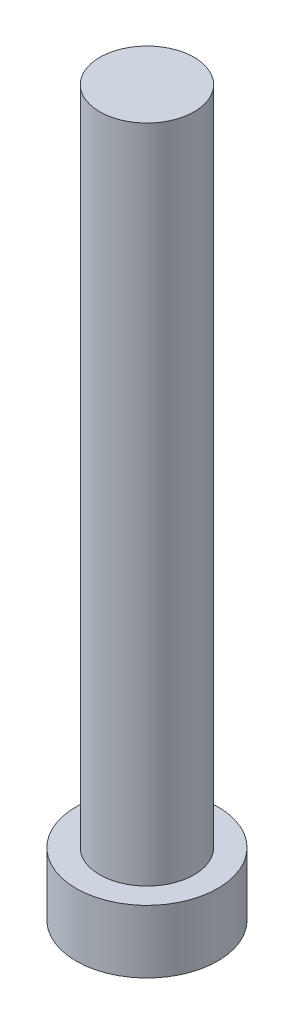
ISO-10303-21;
HEADER;
FILE_DESCRIPTION(('STEP AP214'),'2;1');
FILE_NAME('part.step','',(''),(''),'','','');
FILE_SCHEMA(('AUTOMOTIVE_DESIGN { 1 0 10303 214 1 1 1 1 }'));
ENDSEC;
DATA;
#1=APPLICATION_CONTEXT('core data for automotive mechanical design processes');
#2=APPLICATION_PROTOCOL_DEFINITION('international standard','automotive_design',2000,#1);
#3=PRODUCT_CONTEXT('',#1,'mechanical');
#4=PRODUCT('Part','Part','',(#3));
#5=PRODUCT_RELATED_PRODUCT_CATEGORY('part','',(#4));
#6=PRODUCT_DEFINITION_FORMATION('','',#4);
#7=PRODUCT_DEFINITION_CONTEXT('part definition',#1,'design');
#8=PRODUCT_DEFINITION('design','',#6,#7);
#9=PRODUCT_DEFINITION_SHAPE('','',#8);
#10=(LENGTH_UNIT() NAMED_UNIT(*) SI_UNIT(.MILLI.,.METRE.));
#11=(NAMED_UNIT(*) PLANE_ANGLE_UNIT() SI_UNIT($,.RADIAN.));
#12=(NAMED_UNIT(*) SI_UNIT($,.STERADIAN.) SOLID_ANGLE_UNIT());
#13=UNCERTAINTY_MEASURE_WITH_UNIT(LENGTH_MEASURE(1.E-05),#10,'distance_accuracy_value','');
#14=(GEOMETRIC_REPRESENTATION_CONTEXT(3) GLOBAL_UNCERTAINTY_ASSIGNED_CONTEXT((#13)) GLOBAL_UNIT_ASSIGNED_CONTEXT((#10,
#11,#12)) REPRESENTATION_CONTEXT('',''));
#15=CARTESIAN_POINT('',(0.,0.,0.));
#16=DIRECTION('',(0.,0.,1.));
#17=DIRECTION('',(1.,0.,0.));
#18=AXIS2_PLACEMENT_3D('',#15,#16,#17);
#19=CARTESIAN_POINT('',(0.,20.,0.));
#20=DIRECTION('',(0.,-1.,0.));
#21=DIRECTION('',(0.,0.,-1.));
#22=AXIS2_PLACEMENT_3D('',#19,#20,#21);
#23=CYLINDRICAL_SURFACE('',#22,22.5);
#24=CARTESIAN_POINT('',(0.,20.,0.));
#25=DIRECTION('',(0.,1.,0.));
#26=DIRECTION('',(0.,0.,1.));
#27=AXIS2_PLACEMENT_3D('',#24,#25,#26);
#28=CIRCLE('',#27,22.5);
#29=CARTESIAN_POINT('',(0.,20.,22.5));
#30=VERTEX_POINT('',#29);
#31=EDGE_CURVE('E42',#30,#30,#28,.T.);
#32=ORIENTED_EDGE('',*,*,#31,.F.);
#33=EDGE_LOOP('',(#32));
#34=FACE_BOUND('',#33,.T.);
#35=CARTESIAN_POINT('',(0.,0.,0.));
#36=DIRECTION('',(0.,1.,0.));
#37=DIRECTION('',(0.,0.,1.));
#38=AXIS2_PLACEMENT_3D('',#35,#36,#37);
#39=CIRCLE('',#38,22.5);
#40=CARTESIAN_POINT('',(0.,0.,22.5));
#41=VERTEX_POINT('',#40);
#42=EDGE_CURVE('E38',#41,#41,#39,.T.);
#43=ORIENTED_EDGE('',*,*,#42,.T.);
#44=EDGE_LOOP('',(#43));
#45=FACE_BOUND('',#44,.T.);
#46=ADVANCED_FACE('F35',(#34,#45),#23,.T.);
#47=CARTESIAN_POINT('',(0.,20.,0.));
#48=DIRECTION('',(0.,1.,0.));
#49=DIRECTION('',(0.,0.,1.));
#50=AXIS2_PLACEMENT_3D('',#47,#48,#49);
#51=PLANE('',#50);
#52=CARTESIAN_POINT('',(0.,20.,0.));
#53=DIRECTION('',(0.,1.,0.));
#54=DIRECTION('',(0.,0.,1.));
#55=AXIS2_PLACEMENT_3D('',#52,#53,#54);
#56=CIRCLE('',#55,15.);
#57=CARTESIAN_POINT('',(0.,20.,15.));
#58=VERTEX_POINT('',#57);
#59=EDGE_CURVE('E10',#58,#58,#56,.T.);
#60=ORIENTED_EDGE('',*,*,#59,.F.);
#61=EDGE_LOOP('',(#60));
#62=FACE_BOUND('',#61,.T.);
#63=ORIENTED_EDGE('',*,*,#31,.T.);
#64=EDGE_LOOP('',(#63));
#65=FACE_BOUND('',#64,.T.);
#66=ADVANCED_FACE('F59',(#62,#65),#51,.T.);
#67=CARTESIAN_POINT('',(0.,0.,0.));
#68=DIRECTION('',(0.,1.,0.));
#69=DIRECTION('',(0.,0.,1.));
#70=AXIS2_PLACEMENT_3D('',#67,#68,#69);
#71=PLANE('',#70);
#72=ORIENTED_EDGE('',*,*,#42,.F.);
#73=EDGE_LOOP('',(#72));
#74=FACE_BOUND('',#73,.T.);
#75=ADVANCED_FACE('F56',(#74),#71,.F.);
#76=CARTESIAN_POINT('',(0.,230.,0.));
#77=DIRECTION('',(0.,-1.,0.));
#78=DIRECTION('',(0.,0.,-1.));
#79=AXIS2_PLACEMENT_3D('',#76,#77,#78);
#80=CYLINDRICAL_SURFACE('',#79,15.);
#81=CARTESIAN_POINT('',(0.,230.,0.));
#82=DIRECTION('',(0.,1.,0.));
#83=DIRECTION('',(0.,0.,1.));
#84=AXIS2_PLACEMENT_3D('',#81,#82,#83);
#85=CIRCLE('',#84,15.);
#86=CARTESIAN_POINT('',(0.,230.,15.));
#87=VERTEX_POINT('',#86);
#88=EDGE_CURVE('E48',#87,#87,#85,.T.);
#89=ORIENTED_EDGE('',*,*,#88,.F.);
#90=EDGE_LOOP('',(#89));
#91=FACE_BOUND('',#90,.T.);
#92=ORIENTED_EDGE('',*,*,#59,.T.);
#93=EDGE_LOOP('',(#92));
#94=FACE_BOUND('',#93,.T.);
#95=ADVANCED_FACE('F58',(#91,#94),#80,.T.);
#96=CARTESIAN_POINT('',(0.,230.,0.));
#97=DIRECTION('',(0.,1.,0.));
#98=DIRECTION('',(0.,0.,1.));
#99=AXIS2_PLACEMENT_3D('',#96,#97,#98);
#100=PLANE('',#99);
#101=ORIENTED_EDGE('',*,*,#88,.T.);
#102=EDGE_LOOP('',(#101));
#103=FACE_BOUND('',#102,.T.);
#104=ADVANCED_FACE('F64',(#103),#100,.T.);
#105=CLOSED_SHELL('',(#46,#66,#75,#95,#104));
#106=MANIFOLD_SOLID_BREP('B2',#105);
#107=ADVANCED_BREP_SHAPE_REPRESENTATION('',(#18,#106),#14);
#108=SHAPE_DEFINITION_REPRESENTATION(#9,#107);
ENDSEC;
END-ISO-10303-21;
